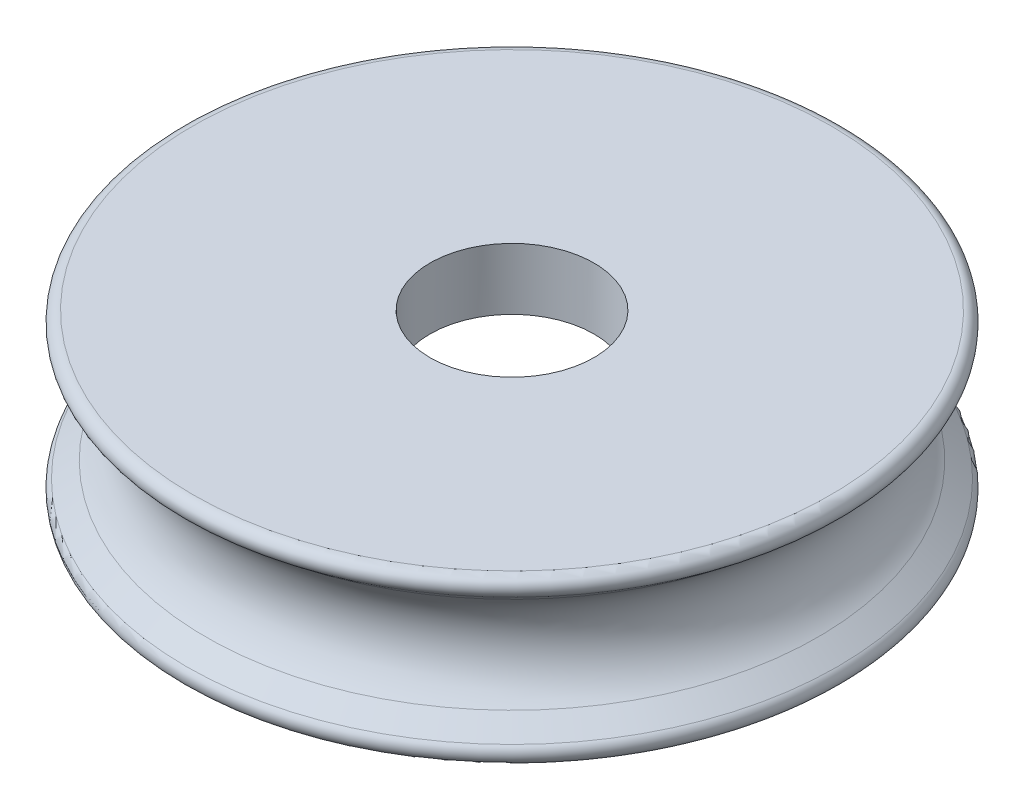
ISO-10303-21;
HEADER;
FILE_DESCRIPTION(('STEP AP214'),'2;1');
FILE_NAME('part.step','',(''),(''),'','','');
FILE_SCHEMA(('AUTOMOTIVE_DESIGN { 1 0 10303 214 1 1 1 1 }'));
ENDSEC;
DATA;
#1=APPLICATION_CONTEXT('core data for automotive mechanical design processes');
#2=APPLICATION_PROTOCOL_DEFINITION('international standard','automotive_design',2000,#1);
#3=PRODUCT_CONTEXT('',#1,'mechanical');
#4=PRODUCT('Part','Part','',(#3));
#5=PRODUCT_RELATED_PRODUCT_CATEGORY('part','',(#4));
#6=PRODUCT_DEFINITION_FORMATION('','',#4);
#7=PRODUCT_DEFINITION_CONTEXT('part definition',#1,'design');
#8=PRODUCT_DEFINITION('design','',#6,#7);
#9=PRODUCT_DEFINITION_SHAPE('','',#8);
#10=(LENGTH_UNIT() NAMED_UNIT(*) SI_UNIT(.MILLI.,.METRE.));
#11=(NAMED_UNIT(*) PLANE_ANGLE_UNIT() SI_UNIT($,.RADIAN.));
#12=(NAMED_UNIT(*) SI_UNIT($,.STERADIAN.) SOLID_ANGLE_UNIT());
#13=UNCERTAINTY_MEASURE_WITH_UNIT(LENGTH_MEASURE(1.E-05),#10,'distance_accuracy_value','');
#14=(GEOMETRIC_REPRESENTATION_CONTEXT(3) GLOBAL_UNCERTAINTY_ASSIGNED_CONTEXT((#13)) GLOBAL_UNIT_ASSIGNED_CONTEXT((#10,
#11,#12)) REPRESENTATION_CONTEXT('',''));
#15=CARTESIAN_POINT('',(0.,0.,0.));
#16=DIRECTION('',(0.,0.,1.));
#17=DIRECTION('',(1.,0.,0.));
#18=AXIS2_PLACEMENT_3D('',#15,#16,#17);
#19=CARTESIAN_POINT('',(0.,0.,0.));
#20=DIRECTION('',(0.,1.,0.));
#21=DIRECTION('',(0.,0.,1.));
#22=AXIS2_PLACEMENT_3D('',#19,#20,#21);
#23=PLANE('',#22);
#24=CARTESIAN_POINT('',(0.,0.,0.));
#25=DIRECTION('',(0.,1.,0.));
#26=DIRECTION('',(0.,0.,1.));
#27=AXIS2_PLACEMENT_3D('',#24,#25,#26);
#28=CIRCLE('',#27,15.5746094703209);
#29=CARTESIAN_POINT('',(0.,0.,15.5746094703209));
#30=VERTEX_POINT('',#29);
#31=EDGE_CURVE('E36',#30,#30,#28,.F.);
#32=ORIENTED_EDGE('',*,*,#31,.T.);
#33=EDGE_LOOP('',(#32));
#34=FACE_BOUND('',#33,.T.);
#35=CARTESIAN_POINT('',(0.,0.,0.));
#36=DIRECTION('',(0.,-1.,0.));
#37=DIRECTION('',(0.,0.,-1.));
#38=AXIS2_PLACEMENT_3D('',#35,#36,#37);
#39=CIRCLE('',#38,12.);
#40=CARTESIAN_POINT('',(0.,0.,-12.));
#41=VERTEX_POINT('',#40);
#42=EDGE_CURVE('E50',#41,#41,#39,.T.);
#43=ORIENTED_EDGE('',*,*,#42,.F.);
#44=EDGE_LOOP('',(#43));
#45=FACE_BOUND('',#44,.T.);
#46=ADVANCED_FACE('F29',(#34,#45),#23,.F.);
#47=CARTESIAN_POINT('',(0.,5.,0.));
#48=DIRECTION('',(0.,-1.,0.));
#49=DIRECTION('',(0.,0.,-1.));
#50=AXIS2_PLACEMENT_3D('',#47,#48,#49);
#51=CYLINDRICAL_SURFACE('',#50,12.);
#52=CARTESIAN_POINT('',(0.,5.,0.));
#53=DIRECTION('',(0.,-1.,0.));
#54=DIRECTION('',(0.,0.,-1.));
#55=AXIS2_PLACEMENT_3D('',#52,#53,#54);
#56=CIRCLE('',#55,12.);
#57=CARTESIAN_POINT('',(0.,5.,-12.));
#58=VERTEX_POINT('',#57);
#59=EDGE_CURVE('E49',#58,#58,#56,.T.);
#60=ORIENTED_EDGE('',*,*,#59,.F.);
#61=EDGE_LOOP('',(#60));
#62=FACE_BOUND('',#61,.T.);
#63=ORIENTED_EDGE('',*,*,#42,.T.);
#64=EDGE_LOOP('',(#63));
#65=FACE_BOUND('',#64,.T.);
#66=ADVANCED_FACE('F99',(#62,#65),#51,.F.);
#67=CARTESIAN_POINT('',(0.,5.,0.));
#68=DIRECTION('',(0.,-1.,0.));
#69=DIRECTION('',(0.,0.,-1.));
#70=AXIS2_PLACEMENT_3D('',#67,#68,#69);
#71=PLANE('',#70);
#72=CARTESIAN_POINT('',(0.,5.,0.));
#73=DIRECTION('',(0.,-1.,0.));
#74=DIRECTION('',(0.,0.,-1.));
#75=AXIS2_PLACEMENT_3D('',#72,#73,#74);
#76=CIRCLE('',#75,4.);
#77=CARTESIAN_POINT('',(0.,5.,-4.));
#78=VERTEX_POINT('',#77);
#79=EDGE_CURVE('E61',#78,#78,#76,.T.);
#80=ORIENTED_EDGE('',*,*,#79,.F.);
#81=EDGE_LOOP('',(#80));
#82=FACE_BOUND('',#81,.T.);
#83=ORIENTED_EDGE('',*,*,#59,.T.);
#84=EDGE_LOOP('',(#83));
#85=FACE_BOUND('',#84,.T.);
#86=ADVANCED_FACE('F95',(#82,#85),#71,.T.);
#87=CARTESIAN_POINT('',(0.,1.65739357167091,0.));
#88=DIRECTION('',(0.,-1.,0.));
#89=DIRECTION('',(0.,0.,-1.));
#90=AXIS2_PLACEMENT_3D('',#87,#88,#89);
#91=CONICAL_SURFACE('',#90,14.9282580354114,0.896055384571344);
#92=CARTESIAN_POINT('',(0.,0.890434404721516,0.));
#93=DIRECTION('',(0.,1.,0.));
#94=DIRECTION('',(0.,0.,1.));
#95=AXIS2_PLACEMENT_3D('',#92,#93,#94);
#96=CIRCLE('',#95,15.8869569940981);
#97=CARTESIAN_POINT('',(0.,0.890434404721516,15.8869569940981));
#98=VERTEX_POINT('',#97);
#99=EDGE_CURVE('E10',#98,#98,#96,.T.);
#100=ORIENTED_EDGE('',*,*,#99,.T.);
#101=EDGE_LOOP('',(#100));
#102=FACE_BOUND('',#101,.T.);
#103=CARTESIAN_POINT('',(0.,1.65739357167091,0.));
#104=DIRECTION('',(0.,-1.,0.));
#105=DIRECTION('',(0.,0.,-1.));
#106=AXIS2_PLACEMENT_3D('',#103,#104,#105);
#107=CIRCLE('',#106,14.9282580354114);
#108=CARTESIAN_POINT('',(0.,1.65739357167091,-14.9282580354114));
#109=VERTEX_POINT('',#108);
#110=EDGE_CURVE('E53',#109,#109,#107,.T.);
#111=ORIENTED_EDGE('',*,*,#110,.T.);
#112=EDGE_LOOP('',(#111));
#113=FACE_BOUND('',#112,.T.);
#114=ADVANCED_FACE('F89',(#102,#113),#91,.T.);
#115=CARTESIAN_POINT('',(0.,4.,0.));
#116=DIRECTION('',(0.,-1.,0.));
#117=DIRECTION('',(0.,0.,-1.));
#118=AXIS2_PLACEMENT_3D('',#115,#116,#117);
#119=TOROIDAL_SURFACE('',#118,16.8023431780746,3.);
#120=ORIENTED_EDGE('',*,*,#110,.F.);
#121=EDGE_LOOP('',(#120));
#122=FACE_BOUND('',#121,.T.);
#123=CARTESIAN_POINT('',(0.,6.34260642832909,0.));
#124=DIRECTION('',(0.,-1.,0.));
#125=DIRECTION('',(0.,0.,-1.));
#126=AXIS2_PLACEMENT_3D('',#123,#124,#125);
#127=CIRCLE('',#126,14.9282580354114);
#128=CARTESIAN_POINT('',(0.,6.34260642832909,-14.9282580354114));
#129=VERTEX_POINT('',#128);
#130=EDGE_CURVE('E58',#129,#129,#127,.T.);
#131=ORIENTED_EDGE('',*,*,#130,.T.);
#132=EDGE_LOOP('',(#131));
#133=FACE_BOUND('',#132,.T.);
#134=ADVANCED_FACE('F84',(#122,#133),#119,.F.);
#135=CARTESIAN_POINT('',(0.,8.,0.));
#136=DIRECTION('',(0.,1.,0.));
#137=DIRECTION('',(0.,0.,1.));
#138=AXIS2_PLACEMENT_3D('',#135,#136,#137);
#139=CONICAL_SURFACE('',#138,17.,0.896055384571344);
#140=CARTESIAN_POINT('',(0.,7.10956559527848,0.));
#141=DIRECTION('',(0.,1.,0.));
#142=DIRECTION('',(0.,0.,1.));
#143=AXIS2_PLACEMENT_3D('',#140,#141,#142);
#144=CIRCLE('',#143,15.8869569940981);
#145=CARTESIAN_POINT('',(0.,7.10956559527848,15.8869569940981));
#146=VERTEX_POINT('',#145);
#147=EDGE_CURVE('E44',#146,#146,#144,.F.);
#148=ORIENTED_EDGE('',*,*,#147,.T.);
#149=EDGE_LOOP('',(#148));
#150=FACE_BOUND('',#149,.T.);
#151=ORIENTED_EDGE('',*,*,#130,.F.);
#152=EDGE_LOOP('',(#151));
#153=FACE_BOUND('',#152,.T.);
#154=ADVANCED_FACE('F74',(#150,#153),#139,.T.);
#155=CARTESIAN_POINT('',(0.,8.,0.));
#156=DIRECTION('',(0.,1.,0.));
#157=DIRECTION('',(0.,0.,1.));
#158=AXIS2_PLACEMENT_3D('',#155,#156,#157);
#159=PLANE('',#158);
#160=CARTESIAN_POINT('',(0.,8.,0.));
#161=DIRECTION('',(0.,1.,0.));
#162=DIRECTION('',(0.,0.,1.));
#163=AXIS2_PLACEMENT_3D('',#160,#161,#162);
#164=CIRCLE('',#163,4.);
#165=CARTESIAN_POINT('',(0.,8.,4.));
#166=VERTEX_POINT('',#165);
#167=EDGE_CURVE('E64',#166,#166,#164,.T.);
#168=ORIENTED_EDGE('',*,*,#167,.F.);
#169=EDGE_LOOP('',(#168));
#170=FACE_BOUND('',#169,.T.);
#171=CARTESIAN_POINT('',(0.,8.,0.));
#172=DIRECTION('',(0.,1.,0.));
#173=DIRECTION('',(0.,0.,1.));
#174=AXIS2_PLACEMENT_3D('',#171,#172,#173);
#175=CIRCLE('',#174,15.5746094703209);
#176=CARTESIAN_POINT('',(0.,8.,15.5746094703209));
#177=VERTEX_POINT('',#176);
#178=EDGE_CURVE('E40',#177,#177,#175,.T.);
#179=ORIENTED_EDGE('',*,*,#178,.T.);
#180=EDGE_LOOP('',(#179));
#181=FACE_BOUND('',#180,.T.);
#182=ADVANCED_FACE('F70',(#170,#181),#159,.T.);
#183=CARTESIAN_POINT('',(0.,7.5,0.));
#184=DIRECTION('',(0.,1.,0.));
#185=DIRECTION('',(0.,0.,1.));
#186=AXIS2_PLACEMENT_3D('',#183,#184,#185);
#187=TOROIDAL_SURFACE('',#186,15.5746094703209,0.5);
#188=ORIENTED_EDGE('',*,*,#178,.F.);
#189=EDGE_LOOP('',(#188));
#190=FACE_BOUND('',#189,.T.);
#191=ORIENTED_EDGE('',*,*,#147,.F.);
#192=EDGE_LOOP('',(#191));
#193=FACE_BOUND('',#192,.T.);
#194=ADVANCED_FACE('F73',(#190,#193),#187,.T.);
#195=CARTESIAN_POINT('',(0.,0.5,0.));
#196=DIRECTION('',(0.,1.,0.));
#197=DIRECTION('',(0.,0.,1.));
#198=AXIS2_PLACEMENT_3D('',#195,#196,#197);
#199=TOROIDAL_SURFACE('',#198,15.5746094703209,0.5);
#200=ORIENTED_EDGE('',*,*,#99,.F.);
#201=EDGE_LOOP('',(#200));
#202=FACE_BOUND('',#201,.T.);
#203=ORIENTED_EDGE('',*,*,#31,.F.);
#204=EDGE_LOOP('',(#203));
#205=FACE_BOUND('',#204,.T.);
#206=ADVANCED_FACE('F31',(#202,#205),#199,.T.);
#207=CARTESIAN_POINT('',(0.,0.,0.));
#208=DIRECTION('',(0.,1.,0.));
#209=DIRECTION('',(0.,0.,1.));
#210=AXIS2_PLACEMENT_3D('',#207,#208,#209);
#211=CYLINDRICAL_SURFACE('',#210,4.);
#212=ORIENTED_EDGE('',*,*,#79,.T.);
#213=EDGE_LOOP('',(#212));
#214=FACE_BOUND('',#213,.T.);
#215=ORIENTED_EDGE('',*,*,#167,.T.);
#216=EDGE_LOOP('',(#215));
#217=FACE_BOUND('',#216,.T.);
#218=ADVANCED_FACE('F68',(#214,#217),#211,.F.);
#219=CLOSED_SHELL('',(#46,#66,#86,#114,#134,#154,#182,#194,#206,#218));
#220=MANIFOLD_SOLID_BREP('B2',#219);
#221=ADVANCED_BREP_SHAPE_REPRESENTATION('',(#18,#220),#14);
#222=SHAPE_DEFINITION_REPRESENTATION(#9,#221);
ENDSEC;
END-ISO-10303-21;
